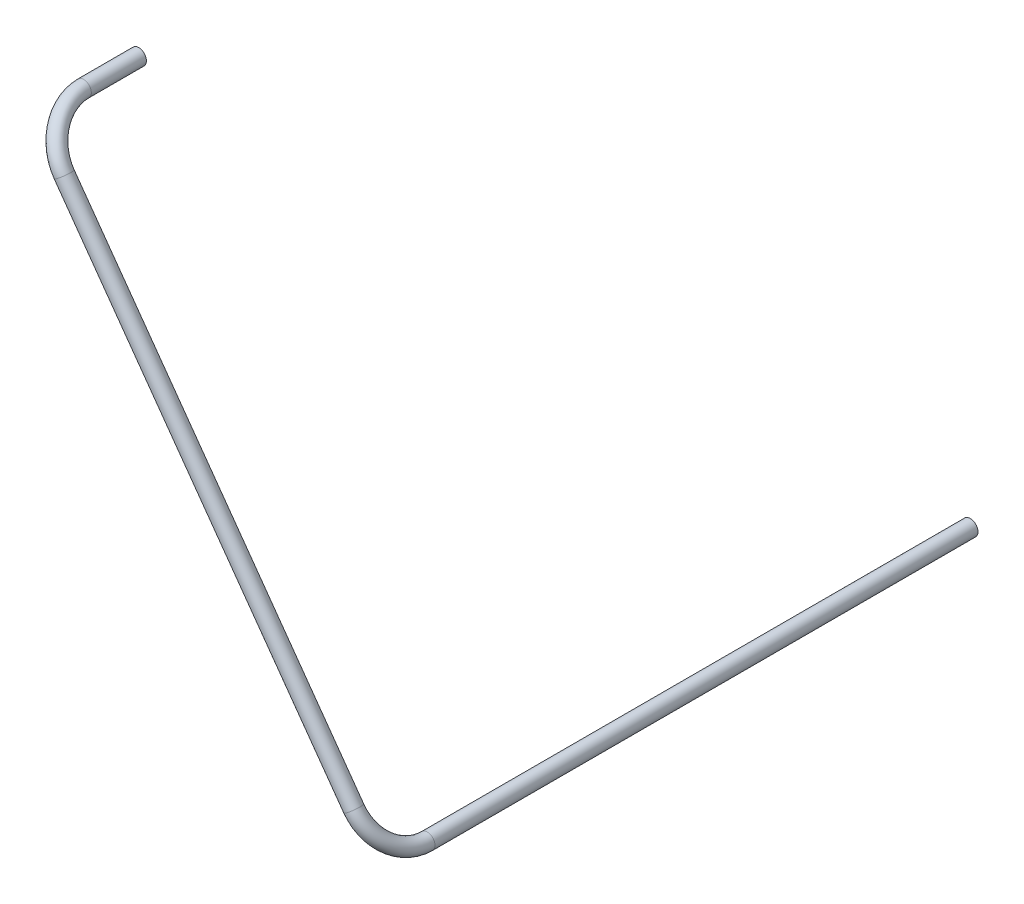
ISO-10303-21;
HEADER;
FILE_DESCRIPTION(('STEP AP214'),'2;1');
FILE_NAME('part.step','',(''),(''),'','','');
FILE_SCHEMA(('AUTOMOTIVE_DESIGN { 1 0 10303 214 1 1 1 1 }'));
ENDSEC;
DATA;
#1=APPLICATION_CONTEXT('core data for automotive mechanical design processes');
#2=APPLICATION_PROTOCOL_DEFINITION('international standard','automotive_design',2000,#1);
#3=PRODUCT_CONTEXT('',#1,'mechanical');
#4=PRODUCT('Part','Part','',(#3));
#5=PRODUCT_RELATED_PRODUCT_CATEGORY('part','',(#4));
#6=PRODUCT_DEFINITION_FORMATION('','',#4);
#7=PRODUCT_DEFINITION_CONTEXT('part definition',#1,'design');
#8=PRODUCT_DEFINITION('design','',#6,#7);
#9=PRODUCT_DEFINITION_SHAPE('','',#8);
#10=(LENGTH_UNIT() NAMED_UNIT(*) SI_UNIT(.MILLI.,.METRE.));
#11=(NAMED_UNIT(*) PLANE_ANGLE_UNIT() SI_UNIT($,.RADIAN.));
#12=(NAMED_UNIT(*) SI_UNIT($,.STERADIAN.) SOLID_ANGLE_UNIT());
#13=UNCERTAINTY_MEASURE_WITH_UNIT(LENGTH_MEASURE(1.E-05),#10,'distance_accuracy_value','');
#14=(GEOMETRIC_REPRESENTATION_CONTEXT(3) GLOBAL_UNCERTAINTY_ASSIGNED_CONTEXT((#13)) GLOBAL_UNIT_ASSIGNED_CONTEXT((#10,
#11,#12)) REPRESENTATION_CONTEXT('',''));
#15=CARTESIAN_POINT('',(0.,0.,0.));
#16=DIRECTION('',(0.,0.,1.));
#17=DIRECTION('',(1.,0.,0.));
#18=AXIS2_PLACEMENT_3D('',#15,#16,#17);
#19=CARTESIAN_POINT('',(282.010871305788,-393.82561051938,45.2248334851842));
#20=DIRECTION('',(0.,0.,-1.));
#21=DIRECTION('',(0.,1.,0.));
#22=AXIS2_PLACEMENT_3D('',#19,#20,#21);
#23=CYLINDRICAL_SURFACE('',#22,6.35);
#24=CARTESIAN_POINT('',(282.010871305788,-393.82561051938,45.2248334851842));
#25=DIRECTION('',(0.,0.,-1.));
#26=DIRECTION('',(0.322076822253795,0.946713536697822,0.));
#27=AXIS2_PLACEMENT_3D('',#24,#25,#26);
#28=CIRCLE('',#27,6.35);
#29=CARTESIAN_POINT('',(285.707867203451,-398.988431582778,45.2248334851842));
#30=VERTEX_POINT('',#29);
#31=EDGE_CURVE('E47',#30,#30,#28,.T.);
#32=ORIENTED_EDGE('',*,*,#31,.T.);
#33=EDGE_LOOP('',(#32));
#34=FACE_BOUND('',#33,.T.);
#35=CARTESIAN_POINT('',(282.010871305789,-393.82561051938,-400.347253912724));
#36=DIRECTION('',(0.,0.,-1.));
#37=DIRECTION('',(0.322076822253795,0.946713536697822,0.));
#38=AXIS2_PLACEMENT_3D('',#35,#36,#37);
#39=CIRCLE('',#38,6.35);
#40=CARTESIAN_POINT('',(284.0560591271,-387.813979561349,-400.347253912724));
#41=VERTEX_POINT('',#40);
#42=EDGE_CURVE('E12',#41,#41,#39,.T.);
#43=ORIENTED_EDGE('',*,*,#42,.F.);
#44=EDGE_LOOP('',(#43));
#45=FACE_BOUND('',#44,.T.);
#46=ADVANCED_FACE('F41',(#34,#45),#23,.T.);
#47=CARTESIAN_POINT('',(259.828895919812,-362.848684138993,45.2248334851842));
#48=DIRECTION('',(0.813042687149265,0.582204078372097,0.));
#49=DIRECTION('',(-0.582204078372097,0.813042687149265,0.));
#50=AXIS2_PLACEMENT_3D('',#47,#48,#49);
#51=TOROIDAL_SURFACE('',#50,38.1,6.35);
#52=CARTESIAN_POINT('',(259.828895919812,-362.848684138993,83.3248334851842));
#53=DIRECTION('',(0.582204078372096,-0.813042687149265,0.));
#54=DIRECTION('',(0.661038411126898,0.473356768348911,-0.582204078372097));
#55=AXIS2_PLACEMENT_3D('',#52,#53,#54);
#56=CIRCLE('',#55,6.35);
#57=CARTESIAN_POINT('',(259.828895919812,-362.848684138993,89.6748334851842));
#58=VERTEX_POINT('',#57);
#59=EDGE_CURVE('E51',#58,#58,#56,.T.);
#60=CARTESIAN_POINT('',(259.828895919812,-362.848684138993,45.2248334851842));
#61=DIRECTION('',(0.813042687149265,0.582204078372097,0.));
#62=DIRECTION('',(-0.582204078372097,0.813042687149265,0.));
#63=AXIS2_PLACEMENT_3D('',#60,#61,#62);
#64=CIRCLE('',#63,44.45);
#65=EDGE_CURVE('',#58,#30,#64,.T.);
#66=ORIENTED_EDGE('',*,*,#59,.T.);
#67=ORIENTED_EDGE('',*,*,#31,.F.);
#68=ORIENTED_EDGE('',*,*,#65,.T.);
#69=ORIENTED_EDGE('',*,*,#65,.F.);
#70=EDGE_LOOP('',(#66,#68,#67,#69));
#71=FACE_BOUND('',#70,.T.);
#72=ADVANCED_FACE('F109',(#71),#51,.T.);
#73=CARTESIAN_POINT('',(22.1819753859768,-30.9769263803867,83.3248334851842));
#74=DIRECTION('',(0.582204078372096,-0.813042687149265,0.));
#75=DIRECTION('',(0.813042687149265,0.582204078372097,0.));
#76=AXIS2_PLACEMENT_3D('',#73,#74,#75);
#77=CYLINDRICAL_SURFACE('',#76,6.35);
#78=CARTESIAN_POINT('',(22.1819753859768,-30.9769263803867,83.3248334851842));
#79=DIRECTION('',(0.582204078372096,-0.813042687149265,0.));
#80=DIRECTION('',(0.661038411126898,0.473356768348911,-0.582204078372097));
#81=AXIS2_PLACEMENT_3D('',#78,#79,#80);
#82=CIRCLE('',#81,6.35);
#83=CARTESIAN_POINT('',(22.1819753859768,-30.9769263803867,89.6748334851842));
#84=VERTEX_POINT('',#83);
#85=EDGE_CURVE('E55',#84,#84,#82,.T.);
#86=ORIENTED_EDGE('',*,*,#85,.T.);
#87=EDGE_LOOP('',(#86));
#88=FACE_BOUND('',#87,.T.);
#89=ORIENTED_EDGE('',*,*,#59,.F.);
#90=EDGE_LOOP('',(#89));
#91=FACE_BOUND('',#90,.T.);
#92=ADVANCED_FACE('F113',(#88,#91),#77,.T.);
#93=CARTESIAN_POINT('',(22.1819753859768,-30.9769263803867,45.2248334851842));
#94=DIRECTION('',(0.813042687149265,0.582204078372097,0.));
#95=DIRECTION('',(-0.582204078372096,0.813042687149265,0.));
#96=AXIS2_PLACEMENT_3D('',#93,#94,#95);
#97=TOROIDAL_SURFACE('',#96,38.0999999999999,6.35);
#98=CARTESIAN_POINT('',(0.,0.,45.2248334851842));
#99=DIRECTION('',(0.,0.,1.));
#100=DIRECTION('',(1.,0.,0.));
#101=AXIS2_PLACEMENT_3D('',#98,#99,#100);
#102=CIRCLE('',#101,6.35);
#103=CARTESIAN_POINT('',(-3.69699589766292,5.16282106339796,45.2248334851842));
#104=VERTEX_POINT('',#103);
#105=EDGE_CURVE('E60',#104,#104,#102,.T.);
#106=CARTESIAN_POINT('',(22.1819753859768,-30.9769263803867,45.2248334851842));
#107=DIRECTION('',(0.813042687149265,0.582204078372097,0.));
#108=DIRECTION('',(-0.582204078372096,0.813042687149265,0.));
#109=AXIS2_PLACEMENT_3D('',#106,#107,#108);
#110=CIRCLE('',#109,44.4499999999999);
#111=EDGE_CURVE('',#104,#84,#110,.T.);
#112=ORIENTED_EDGE('',*,*,#105,.T.);
#113=ORIENTED_EDGE('',*,*,#85,.F.);
#114=ORIENTED_EDGE('',*,*,#111,.T.);
#115=ORIENTED_EDGE('',*,*,#111,.F.);
#116=EDGE_LOOP('',(#112,#114,#113,#115));
#117=FACE_BOUND('',#116,.T.);
#118=ADVANCED_FACE('F104',(#117),#97,.T.);
#119=CARTESIAN_POINT('',(0.,0.,45.2248334851842));
#120=DIRECTION('',(0.,0.,-1.));
#121=DIRECTION('',(-1.,0.,0.));
#122=AXIS2_PLACEMENT_3D('',#119,#120,#121);
#123=CYLINDRICAL_SURFACE('',#122,6.35);
#124=ORIENTED_EDGE('',*,*,#105,.F.);
#125=EDGE_LOOP('',(#124));
#126=FACE_BOUND('',#125,.T.);
#127=CARTESIAN_POINT('',(0.,0.,0.));
#128=DIRECTION('',(0.,0.,1.));
#129=DIRECTION('',(1.,0.,0.));
#130=AXIS2_PLACEMENT_3D('',#127,#128,#129);
#131=CIRCLE('',#130,6.35);
#132=CARTESIAN_POINT('',(6.35,0.,0.));
#133=VERTEX_POINT('',#132);
#134=EDGE_CURVE('E61',#133,#133,#131,.T.);
#135=ORIENTED_EDGE('',*,*,#134,.T.);
#136=EDGE_LOOP('',(#135));
#137=FACE_BOUND('',#136,.T.);
#138=ADVANCED_FACE('F96',(#126,#137),#123,.T.);
#139=CARTESIAN_POINT('',(282.010871305789,-393.82561051938,-400.347253912724));
#140=DIRECTION('',(0.,0.,-1.));
#141=DIRECTION('',(0.322076822253795,0.946713536697822,0.));
#142=AXIS2_PLACEMENT_3D('',#139,#140,#141);
#143=PLANE('',#142);
#144=CARTESIAN_POINT('',(282.010871305789,-393.82561051938,-400.347253912724));
#145=DIRECTION('',(0.,0.,-1.));
#146=DIRECTION('',(0.,1.,0.));
#147=AXIS2_PLACEMENT_3D('',#144,#145,#146);
#148=CIRCLE('',#147,5.1054);
#149=CARTESIAN_POINT('',(282.010871305789,-388.72021051938,-400.347253912724));
#150=VERTEX_POINT('',#149);
#151=EDGE_CURVE('E64',#150,#150,#148,.T.);
#152=ORIENTED_EDGE('',*,*,#151,.F.);
#153=EDGE_LOOP('',(#152));
#154=FACE_BOUND('',#153,.T.);
#155=ORIENTED_EDGE('',*,*,#42,.T.);
#156=EDGE_LOOP('',(#155));
#157=FACE_BOUND('',#156,.T.);
#158=ADVANCED_FACE('F94',(#154,#157),#143,.T.);
#159=CARTESIAN_POINT('',(0.,0.,0.));
#160=DIRECTION('',(0.,0.,1.));
#161=DIRECTION('',(1.,0.,0.));
#162=AXIS2_PLACEMENT_3D('',#159,#160,#161);
#163=PLANE('',#162);
#164=CARTESIAN_POINT('',(0.,0.,0.));
#165=DIRECTION('',(0.,0.,1.));
#166=DIRECTION('',(1.,0.,0.));
#167=AXIS2_PLACEMENT_3D('',#164,#165,#166);
#168=CIRCLE('',#167,5.1054);
#169=CARTESIAN_POINT('',(5.1054,0.,0.));
#170=VERTEX_POINT('',#169);
#171=EDGE_CURVE('E67',#170,#170,#168,.T.);
#172=ORIENTED_EDGE('',*,*,#171,.T.);
#173=EDGE_LOOP('',(#172));
#174=FACE_BOUND('',#173,.T.);
#175=ORIENTED_EDGE('',*,*,#134,.F.);
#176=EDGE_LOOP('',(#175));
#177=FACE_BOUND('',#176,.T.);
#178=ADVANCED_FACE('F90',(#174,#177),#163,.F.);
#179=CARTESIAN_POINT('',(282.010871305788,-393.82561051938,45.2248334851842));
#180=DIRECTION('',(0.,0.,-1.));
#181=DIRECTION('',(0.,1.,0.));
#182=AXIS2_PLACEMENT_3D('',#179,#180,#181);
#183=CYLINDRICAL_SURFACE('',#182,5.1054);
#184=CARTESIAN_POINT('',(282.010871305788,-393.82561051938,45.2248334851842));
#185=DIRECTION('',(0.,0.,-1.));
#186=DIRECTION('',(0.,1.,0.));
#187=AXIS2_PLACEMENT_3D('',#184,#185,#186);
#188=CIRCLE('',#187,5.1054);
#189=CARTESIAN_POINT('',(284.983256007509,-397.976518654352,45.2248334851842));
#190=VERTEX_POINT('',#189);
#191=EDGE_CURVE('E73',#190,#190,#188,.T.);
#192=ORIENTED_EDGE('',*,*,#191,.F.);
#193=EDGE_LOOP('',(#192));
#194=FACE_BOUND('',#193,.T.);
#195=ORIENTED_EDGE('',*,*,#151,.T.);
#196=EDGE_LOOP('',(#195));
#197=FACE_BOUND('',#196,.T.);
#198=ADVANCED_FACE('F87',(#194,#197),#183,.F.);
#199=CARTESIAN_POINT('',(259.828895919812,-362.848684138993,45.2248334851842));
#200=DIRECTION('',(0.813042687149265,0.582204078372097,0.));
#201=DIRECTION('',(-0.582204078372097,0.813042687149265,0.));
#202=AXIS2_PLACEMENT_3D('',#199,#200,#201);
#203=TOROIDAL_SURFACE('',#202,38.1,5.1054);
#204=CARTESIAN_POINT('',(259.828895919812,-362.848684138993,83.3248334851842));
#205=DIRECTION('',(-0.582204078372097,0.813042687149265,0.));
#206=DIRECTION('',(-0.813042687149265,-0.582204078372097,0.));
#207=AXIS2_PLACEMENT_3D('',#204,#205,#206);
#208=CIRCLE('',#207,5.1054);
#209=CARTESIAN_POINT('',(259.828895919812,-362.848684138993,88.4302334851842));
#210=VERTEX_POINT('',#209);
#211=EDGE_CURVE('E79',#210,#210,#208,.F.);
#212=CARTESIAN_POINT('',(259.828895919812,-362.848684138993,45.2248334851842));
#213=DIRECTION('',(0.813042687149265,0.582204078372097,0.));
#214=DIRECTION('',(-0.582204078372097,0.813042687149265,0.));
#215=AXIS2_PLACEMENT_3D('',#212,#213,#214);
#216=CIRCLE('',#215,43.2054);
#217=EDGE_CURVE('',#210,#190,#216,.T.);
#218=ORIENTED_EDGE('',*,*,#211,.F.);
#219=ORIENTED_EDGE('',*,*,#191,.T.);
#220=ORIENTED_EDGE('',*,*,#217,.T.);
#221=ORIENTED_EDGE('',*,*,#217,.F.);
#222=EDGE_LOOP('',(#218,#220,#219,#221));
#223=FACE_BOUND('',#222,.T.);
#224=ADVANCED_FACE('F85',(#223),#203,.F.);
#225=CARTESIAN_POINT('',(22.1819753859768,-30.9769263803867,83.3248334851842));
#226=DIRECTION('',(0.582204078372096,-0.813042687149265,0.));
#227=DIRECTION('',(0.813042687149265,0.582204078372097,0.));
#228=AXIS2_PLACEMENT_3D('',#225,#226,#227);
#229=CYLINDRICAL_SURFACE('',#228,5.1054);
#230=CARTESIAN_POINT('',(22.1819753859768,-30.9769263803867,83.3248334851842));
#231=DIRECTION('',(0.582204078372096,-0.813042687149265,0.));
#232=DIRECTION('',(0.813042687149265,0.582204078372097,0.));
#233=AXIS2_PLACEMENT_3D('',#230,#231,#232);
#234=CIRCLE('',#233,5.1054);
#235=CARTESIAN_POINT('',(22.1819753859768,-30.9769263803867,88.4302334851842));
#236=VERTEX_POINT('',#235);
#237=EDGE_CURVE('E76',#236,#236,#234,.T.);
#238=ORIENTED_EDGE('',*,*,#237,.F.);
#239=EDGE_LOOP('',(#238));
#240=FACE_BOUND('',#239,.T.);
#241=ORIENTED_EDGE('',*,*,#211,.T.);
#242=EDGE_LOOP('',(#241));
#243=FACE_BOUND('',#242,.T.);
#244=ADVANCED_FACE('F159',(#240,#243),#229,.F.);
#245=CARTESIAN_POINT('',(22.1819753859768,-30.9769263803867,45.2248334851842));
#246=DIRECTION('',(0.813042687149265,0.582204078372097,0.));
#247=DIRECTION('',(-0.582204078372096,0.813042687149265,0.));
#248=AXIS2_PLACEMENT_3D('',#245,#246,#247);
#249=TOROIDAL_SURFACE('',#248,38.0999999999999,5.1054);
#250=CARTESIAN_POINT('',(0.,0.,45.2248334851842));
#251=DIRECTION('',(0.,0.,-1.));
#252=DIRECTION('',(-1.,0.,0.));
#253=AXIS2_PLACEMENT_3D('',#250,#251,#252);
#254=CIRCLE('',#253,5.1054);
#255=CARTESIAN_POINT('',(-2.97238470172101,4.15090813497199,45.2248334851842));
#256=VERTEX_POINT('',#255);
#257=EDGE_CURVE('E70',#256,#256,#254,.F.);
#258=CARTESIAN_POINT('',(22.1819753859768,-30.9769263803867,45.2248334851842));
#259=DIRECTION('',(0.813042687149265,0.582204078372097,0.));
#260=DIRECTION('',(-0.582204078372096,0.813042687149265,0.));
#261=AXIS2_PLACEMENT_3D('',#258,#259,#260);
#262=CIRCLE('',#261,43.2053999999999);
#263=EDGE_CURVE('',#256,#236,#262,.T.);
#264=ORIENTED_EDGE('',*,*,#257,.F.);
#265=ORIENTED_EDGE('',*,*,#237,.T.);
#266=ORIENTED_EDGE('',*,*,#263,.T.);
#267=ORIENTED_EDGE('',*,*,#263,.F.);
#268=EDGE_LOOP('',(#264,#266,#265,#267));
#269=FACE_BOUND('',#268,.T.);
#270=ADVANCED_FACE('F167',(#269),#249,.F.);
#271=CARTESIAN_POINT('',(0.,0.,45.2248334851842));
#272=DIRECTION('',(0.,0.,-1.));
#273=DIRECTION('',(-1.,0.,0.));
#274=AXIS2_PLACEMENT_3D('',#271,#272,#273);
#275=CYLINDRICAL_SURFACE('',#274,5.1054);
#276=ORIENTED_EDGE('',*,*,#257,.T.);
#277=EDGE_LOOP('',(#276));
#278=FACE_BOUND('',#277,.T.);
#279=ORIENTED_EDGE('',*,*,#171,.F.);
#280=EDGE_LOOP('',(#279));
#281=FACE_BOUND('',#280,.T.);
#282=ADVANCED_FACE('F175',(#278,#281),#275,.F.);
#283=CLOSED_SHELL('',(#46,#72,#92,#118,#138,#158,#178,#198,#224,#244,#270,#282));
#284=MANIFOLD_SOLID_BREP('B2',#283);
#285=ADVANCED_BREP_SHAPE_REPRESENTATION('',(#18,#284),#14);
#286=SHAPE_DEFINITION_REPRESENTATION(#9,#285);
ENDSEC;
END-ISO-10303-21;
